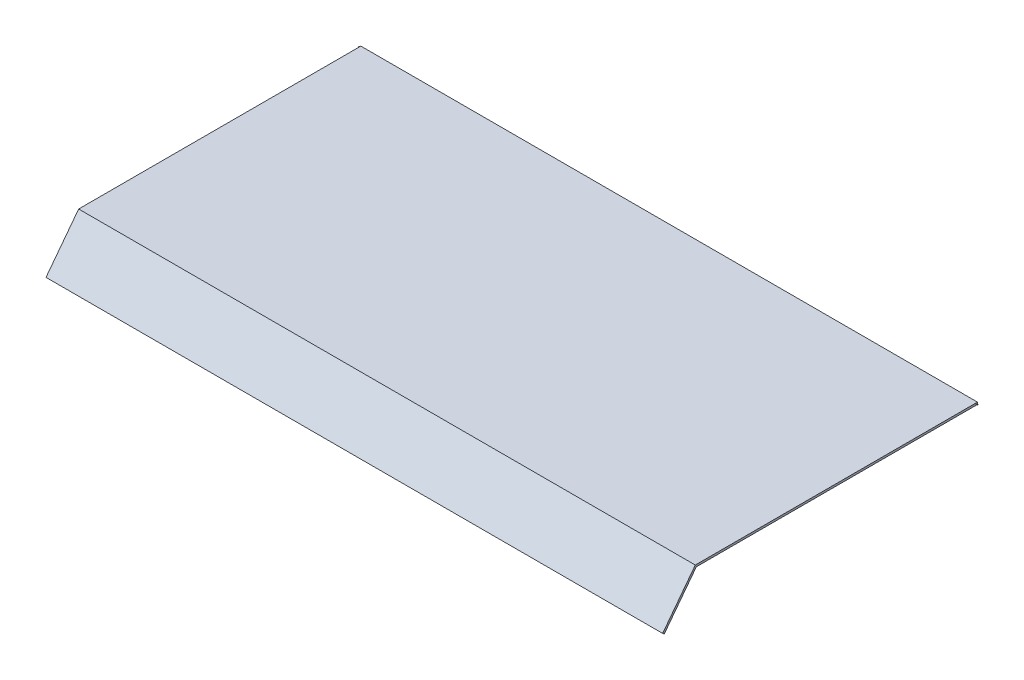
ISO-10303-21;
HEADER;
FILE_DESCRIPTION(('STEP AP214'),'2;1');
FILE_NAME('part.step','',(''),(''),'','','');
FILE_SCHEMA(('AUTOMOTIVE_DESIGN { 1 0 10303 214 1 1 1 1 }'));
ENDSEC;
DATA;
#1=APPLICATION_CONTEXT('core data for automotive mechanical design processes');
#2=APPLICATION_PROTOCOL_DEFINITION('international standard','automotive_design',2000,#1);
#3=PRODUCT_CONTEXT('',#1,'mechanical');
#4=PRODUCT('Part','Part','',(#3));
#5=PRODUCT_RELATED_PRODUCT_CATEGORY('part','',(#4));
#6=PRODUCT_DEFINITION_FORMATION('','',#4);
#7=PRODUCT_DEFINITION_CONTEXT('part definition',#1,'design');
#8=PRODUCT_DEFINITION('design','',#6,#7);
#9=PRODUCT_DEFINITION_SHAPE('','',#8);
#10=(LENGTH_UNIT() NAMED_UNIT(*) SI_UNIT(.MILLI.,.METRE.));
#11=(NAMED_UNIT(*) PLANE_ANGLE_UNIT() SI_UNIT($,.RADIAN.));
#12=(NAMED_UNIT(*) SI_UNIT($,.STERADIAN.) SOLID_ANGLE_UNIT());
#13=UNCERTAINTY_MEASURE_WITH_UNIT(LENGTH_MEASURE(1.E-05),#10,'distance_accuracy_value','');
#14=(GEOMETRIC_REPRESENTATION_CONTEXT(3) GLOBAL_UNCERTAINTY_ASSIGNED_CONTEXT((#13)) GLOBAL_UNIT_ASSIGNED_CONTEXT((#10,
#11,#12)) REPRESENTATION_CONTEXT('',''));
#15=CARTESIAN_POINT('',(0.,0.,0.));
#16=DIRECTION('',(0.,0.,1.));
#17=DIRECTION('',(1.,0.,0.));
#18=AXIS2_PLACEMENT_3D('',#15,#16,#17);
#19=CARTESIAN_POINT('',(147.5,0.,0.));
#20=DIRECTION('',(0.,0.605571808276571,0.795790666583018));
#21=DIRECTION('',(0.,-0.795790666583018,0.605571808276571));
#22=AXIS2_PLACEMENT_3D('',#19,#20,#21);
#23=PLANE('',#22);
#24=DIRECTION('',(-1.,0.,0.));
#25=VECTOR('',#24,1.);
#26=CARTESIAN_POINT('',(147.5,-20.1335038645504,15.3209667493973));
#27=LINE('',#26,#25);
#28=CARTESIAN_POINT('',(147.5,-20.1335038645504,15.3209667493973));
#29=VERTEX_POINT('',#28);
#30=CARTESIAN_POINT('',(-147.5,-20.1335038645504,15.3209667493973));
#31=VERTEX_POINT('',#30);
#32=EDGE_CURVE('E103',#29,#31,#27,.T.);
#33=ORIENTED_EDGE('',*,*,#32,.T.);
#34=DIRECTION('',(0.,0.795790666583018,-0.605571808276571));
#35=VECTOR('',#34,1.);
#36=CARTESIAN_POINT('',(-147.5,0.,0.));
#37=LINE('',#36,#35);
#38=CARTESIAN_POINT('',(-147.5,0.,0.));
#39=VERTEX_POINT('',#38);
#40=EDGE_CURVE('E98',#31,#39,#37,.T.);
#41=ORIENTED_EDGE('',*,*,#40,.T.);
#42=DIRECTION('',(-1.,0.,0.));
#43=VECTOR('',#42,1.);
#44=CARTESIAN_POINT('',(147.5,0.,0.));
#45=LINE('',#44,#43);
#46=CARTESIAN_POINT('',(147.5,0.,0.));
#47=VERTEX_POINT('',#46);
#48=EDGE_CURVE('E39',#47,#39,#45,.T.);
#49=ORIENTED_EDGE('',*,*,#48,.F.);
#50=DIRECTION('',(0.,0.795790666583018,-0.605571808276571));
#51=VECTOR('',#50,1.);
#52=CARTESIAN_POINT('',(147.5,0.,0.));
#53=LINE('',#52,#51);
#54=EDGE_CURVE('E125',#29,#47,#53,.T.);
#55=ORIENTED_EDGE('',*,*,#54,.F.);
#56=EDGE_LOOP('',(#33,#41,#49,#55));
#57=FACE_BOUND('',#56,.T.);
#58=ADVANCED_FACE('F32',(#57),#23,.F.);
#59=CARTESIAN_POINT('',(147.5,0.,0.));
#60=DIRECTION('',(0.,1.,0.));
#61=DIRECTION('',(0.,0.,1.));
#62=AXIS2_PLACEMENT_3D('',#59,#60,#61);
#63=PLANE('',#62);
#64=ORIENTED_EDGE('',*,*,#48,.T.);
#65=DIRECTION('',(0.,0.,-1.));
#66=VECTOR('',#65,1.);
#67=CARTESIAN_POINT('',(-147.5,0.,0.));
#68=LINE('',#67,#66);
#69=CARTESIAN_POINT('',(-147.5,0.,-134.5));
#70=VERTEX_POINT('',#69);
#71=EDGE_CURVE('E87',#39,#70,#68,.T.);
#72=ORIENTED_EDGE('',*,*,#71,.T.);
#73=DIRECTION('',(-1.,0.,0.));
#74=VECTOR('',#73,1.);
#75=CARTESIAN_POINT('',(147.5,0.,-134.5));
#76=LINE('',#75,#74);
#77=CARTESIAN_POINT('',(147.5,0.,-134.5));
#78=VERTEX_POINT('',#77);
#79=EDGE_CURVE('E92',#78,#70,#76,.T.);
#80=ORIENTED_EDGE('',*,*,#79,.F.);
#81=DIRECTION('',(0.,0.,-1.));
#82=VECTOR('',#81,1.);
#83=CARTESIAN_POINT('',(147.5,0.,0.));
#84=LINE('',#83,#82);
#85=EDGE_CURVE('E88',#47,#78,#84,.T.);
#86=ORIENTED_EDGE('',*,*,#85,.F.);
#87=EDGE_LOOP('',(#64,#72,#80,#86));
#88=FACE_BOUND('',#87,.T.);
#89=ADVANCED_FACE('F85',(#88),#63,.F.);
#90=CARTESIAN_POINT('',(147.5,1.,-134.5));
#91=DIRECTION('',(0.,0.,1.));
#92=DIRECTION('',(1.,0.,0.));
#93=AXIS2_PLACEMENT_3D('',#90,#91,#92);
#94=PLANE('',#93);
#95=ORIENTED_EDGE('',*,*,#79,.T.);
#96=DIRECTION('',(0.,1.,0.));
#97=VECTOR('',#96,1.);
#98=CARTESIAN_POINT('',(-147.5,1.,-134.5));
#99=LINE('',#98,#97);
#100=CARTESIAN_POINT('',(-147.5,1.,-134.5));
#101=VERTEX_POINT('',#100);
#102=EDGE_CURVE('E101',#70,#101,#99,.T.);
#103=ORIENTED_EDGE('',*,*,#102,.T.);
#104=DIRECTION('',(-1.,0.,0.));
#105=VECTOR('',#104,1.);
#106=CARTESIAN_POINT('',(147.5,1.,-134.5));
#107=LINE('',#106,#105);
#108=CARTESIAN_POINT('',(147.5,1.,-134.5));
#109=VERTEX_POINT('',#108);
#110=EDGE_CURVE('E139',#109,#101,#107,.T.);
#111=ORIENTED_EDGE('',*,*,#110,.F.);
#112=DIRECTION('',(0.,1.,0.));
#113=VECTOR('',#112,1.);
#114=CARTESIAN_POINT('',(147.5,1.,-134.5));
#115=LINE('',#114,#113);
#116=EDGE_CURVE('E128',#78,#109,#115,.T.);
#117=ORIENTED_EDGE('',*,*,#116,.F.);
#118=EDGE_LOOP('',(#95,#103,#111,#117));
#119=FACE_BOUND('',#118,.T.);
#120=ADVANCED_FACE('F143',(#119),#94,.F.);
#121=CARTESIAN_POINT('',(147.5,1.,0.4956431487404));
#122=DIRECTION('',(0.,-1.,0.));
#123=DIRECTION('',(0.,0.,-1.));
#124=AXIS2_PLACEMENT_3D('',#121,#122,#123);
#125=PLANE('',#124);
#126=ORIENTED_EDGE('',*,*,#110,.T.);
#127=DIRECTION('',(0.,0.,1.));
#128=VECTOR('',#127,1.);
#129=CARTESIAN_POINT('',(-147.5,1.,0.4956431487404));
#130=LINE('',#129,#128);
#131=CARTESIAN_POINT('',(-147.5,1.,0.4956431487404));
#132=VERTEX_POINT('',#131);
#133=EDGE_CURVE('E111',#101,#132,#130,.T.);
#134=ORIENTED_EDGE('',*,*,#133,.T.);
#135=DIRECTION('',(-1.,0.,0.));
#136=VECTOR('',#135,1.);
#137=CARTESIAN_POINT('',(147.5,1.,0.4956431487404));
#138=LINE('',#137,#136);
#139=CARTESIAN_POINT('',(147.5,1.,0.4956431487404));
#140=VERTEX_POINT('',#139);
#141=EDGE_CURVE('E137',#140,#132,#138,.T.);
#142=ORIENTED_EDGE('',*,*,#141,.F.);
#143=DIRECTION('',(0.,0.,1.));
#144=VECTOR('',#143,1.);
#145=CARTESIAN_POINT('',(147.5,1.,0.4956431487404));
#146=LINE('',#145,#144);
#147=EDGE_CURVE('E130',#109,#140,#146,.T.);
#148=ORIENTED_EDGE('',*,*,#147,.F.);
#149=EDGE_LOOP('',(#126,#134,#142,#148));
#150=FACE_BOUND('',#149,.T.);
#151=ADVANCED_FACE('F149',(#150),#125,.F.);
#152=CARTESIAN_POINT('',(147.5,1.,0.4956431487404));
#153=DIRECTION('',(0.,-0.605571808276571,-0.795790666583018));
#154=DIRECTION('',(0.,0.795790666583018,-0.605571808276571));
#155=AXIS2_PLACEMENT_3D('',#152,#153,#154);
#156=PLANE('',#155);
#157=ORIENTED_EDGE('',*,*,#141,.T.);
#158=DIRECTION('',(0.,-0.795790666583018,0.605571808276571));
#159=VECTOR('',#158,1.);
#160=CARTESIAN_POINT('',(-147.5,1.,0.4956431487404));
#161=LINE('',#160,#159);
#162=CARTESIAN_POINT('',(-147.5,-19.5279320562738,16.1167574159803));
#163=VERTEX_POINT('',#162);
#164=EDGE_CURVE('E114',#132,#163,#161,.T.);
#165=ORIENTED_EDGE('',*,*,#164,.T.);
#166=DIRECTION('',(-1.,0.,0.));
#167=VECTOR('',#166,1.);
#168=CARTESIAN_POINT('',(147.5,-19.5279320562738,16.1167574159803));
#169=LINE('',#168,#167);
#170=CARTESIAN_POINT('',(147.5,-19.5279320562738,16.1167574159803));
#171=VERTEX_POINT('',#170);
#172=EDGE_CURVE('E135',#171,#163,#169,.T.);
#173=ORIENTED_EDGE('',*,*,#172,.F.);
#174=DIRECTION('',(0.,-0.795790666583018,0.605571808276571));
#175=VECTOR('',#174,1.);
#176=CARTESIAN_POINT('',(147.5,1.,0.4956431487404));
#177=LINE('',#176,#175);
#178=EDGE_CURVE('E51',#140,#171,#177,.T.);
#179=ORIENTED_EDGE('',*,*,#178,.F.);
#180=EDGE_LOOP('',(#157,#165,#173,#179));
#181=FACE_BOUND('',#180,.T.);
#182=ADVANCED_FACE('F152',(#181),#156,.F.);
#183=CARTESIAN_POINT('',(147.5,-20.1335038645504,15.3209667493973));
#184=DIRECTION('',(0.,0.795790666583016,-0.605571808276574));
#185=DIRECTION('',(0.,0.605571808276574,0.795790666583016));
#186=AXIS2_PLACEMENT_3D('',#183,#184,#185);
#187=PLANE('',#186);
#188=ORIENTED_EDGE('',*,*,#172,.T.);
#189=DIRECTION('',(0.,-0.605571808276574,-0.795790666583016));
#190=VECTOR('',#189,1.);
#191=CARTESIAN_POINT('',(-147.5,-20.1335038645504,15.3209667493973));
#192=LINE('',#191,#190);
#193=EDGE_CURVE('E117',#163,#31,#192,.T.);
#194=ORIENTED_EDGE('',*,*,#193,.T.);
#195=ORIENTED_EDGE('',*,*,#32,.F.);
#196=DIRECTION('',(0.,-0.605571808276574,-0.795790666583016));
#197=VECTOR('',#196,1.);
#198=CARTESIAN_POINT('',(147.5,-20.1335038645504,15.3209667493973));
#199=LINE('',#198,#197);
#200=EDGE_CURVE('E46',#171,#29,#199,.T.);
#201=ORIENTED_EDGE('',*,*,#200,.F.);
#202=EDGE_LOOP('',(#188,#194,#195,#201));
#203=FACE_BOUND('',#202,.T.);
#204=ADVANCED_FACE('F154',(#203),#187,.F.);
#205=CARTESIAN_POINT('',(147.5,0.,0.));
#206=DIRECTION('',(-1.,0.,0.));
#207=DIRECTION('',(0.,0.,1.));
#208=AXIS2_PLACEMENT_3D('',#205,#206,#207);
#209=PLANE('',#208);
#210=CARTESIAN_POINT('',(147.5,0.5,-134.));
#211=DIRECTION('',(-1.,0.,0.));
#212=DIRECTION('',(0.,0.,1.));
#213=AXIS2_PLACEMENT_3D('',#210,#211,#212);
#214=CIRCLE('',#213,0.250000000000013);
#215=CARTESIAN_POINT('',(147.5,0.5,-133.75));
#216=VERTEX_POINT('',#215);
#217=EDGE_CURVE('E11',#216,#216,#214,.F.);
#218=ORIENTED_EDGE('',*,*,#217,.F.);
#219=EDGE_LOOP('',(#218));
#220=FACE_BOUND('',#219,.T.);
#221=ORIENTED_EDGE('',*,*,#54,.T.);
#222=ORIENTED_EDGE('',*,*,#85,.T.);
#223=ORIENTED_EDGE('',*,*,#116,.T.);
#224=ORIENTED_EDGE('',*,*,#147,.T.);
#225=ORIENTED_EDGE('',*,*,#178,.T.);
#226=ORIENTED_EDGE('',*,*,#200,.T.);
#227=EDGE_LOOP('',(#221,#222,#223,#224,#225,#226));
#228=FACE_BOUND('',#227,.T.);
#229=ADVANCED_FACE('F146',(#220,#228),#209,.F.);
#230=CARTESIAN_POINT('',(148.,0.5,-134.));
#231=DIRECTION('',(-1.,0.,0.));
#232=DIRECTION('',(0.,0.,1.));
#233=AXIS2_PLACEMENT_3D('',#230,#231,#232);
#234=CYLINDRICAL_SURFACE('',#233,0.250000000000013);
#235=CARTESIAN_POINT('',(148.,0.5,-134.));
#236=DIRECTION('',(1.,0.,0.));
#237=DIRECTION('',(0.,0.,-1.));
#238=AXIS2_PLACEMENT_3D('',#235,#236,#237);
#239=CIRCLE('',#238,0.250000000000013);
#240=CARTESIAN_POINT('',(148.,0.5,-134.25));
#241=VERTEX_POINT('',#240);
#242=EDGE_CURVE('E122',#241,#241,#239,.T.);
#243=ORIENTED_EDGE('',*,*,#242,.F.);
#244=EDGE_LOOP('',(#243));
#245=FACE_BOUND('',#244,.T.);
#246=ORIENTED_EDGE('',*,*,#217,.T.);
#247=EDGE_LOOP('',(#246));
#248=FACE_BOUND('',#247,.T.);
#249=ADVANCED_FACE('F161',(#245,#248),#234,.T.);
#250=CARTESIAN_POINT('',(148.,0.5,-134.));
#251=DIRECTION('',(1.,0.,0.));
#252=DIRECTION('',(0.,0.,-1.));
#253=AXIS2_PLACEMENT_3D('',#250,#251,#252);
#254=PLANE('',#253);
#255=ORIENTED_EDGE('',*,*,#242,.T.);
#256=EDGE_LOOP('',(#255));
#257=FACE_BOUND('',#256,.T.);
#258=ADVANCED_FACE('F199',(#257),#254,.T.);
#259=CARTESIAN_POINT('',(-147.5,0.,0.));
#260=DIRECTION('',(1.,0.,0.));
#261=DIRECTION('',(0.,0.,1.));
#262=AXIS2_PLACEMENT_3D('',#259,#260,#261);
#263=PLANE('',#262);
#264=CARTESIAN_POINT('',(-147.5,0.5,-134.));
#265=DIRECTION('',(-1.,0.,0.));
#266=DIRECTION('',(0.,0.,1.));
#267=AXIS2_PLACEMENT_3D('',#264,#265,#266);
#268=CIRCLE('',#267,0.250000000000013);
#269=CARTESIAN_POINT('',(-147.5,0.5,-133.75));
#270=VERTEX_POINT('',#269);
#271=EDGE_CURVE('E119',#270,#270,#268,.F.);
#272=ORIENTED_EDGE('',*,*,#271,.T.);
#273=EDGE_LOOP('',(#272));
#274=FACE_BOUND('',#273,.T.);
#275=ORIENTED_EDGE('',*,*,#40,.F.);
#276=ORIENTED_EDGE('',*,*,#193,.F.);
#277=ORIENTED_EDGE('',*,*,#164,.F.);
#278=ORIENTED_EDGE('',*,*,#133,.F.);
#279=ORIENTED_EDGE('',*,*,#102,.F.);
#280=ORIENTED_EDGE('',*,*,#71,.F.);
#281=EDGE_LOOP('',(#275,#276,#277,#278,#279,#280));
#282=FACE_BOUND('',#281,.T.);
#283=ADVANCED_FACE('F96',(#274,#282),#263,.F.);
#284=CARTESIAN_POINT('',(-148.,0.5,-134.));
#285=DIRECTION('',(1.,0.,0.));
#286=DIRECTION('',(0.,0.,1.));
#287=AXIS2_PLACEMENT_3D('',#284,#285,#286);
#288=CYLINDRICAL_SURFACE('',#287,0.250000000000013);
#289=CARTESIAN_POINT('',(-148.,0.5,-134.));
#290=DIRECTION('',(1.,0.,0.));
#291=DIRECTION('',(0.,0.,-1.));
#292=AXIS2_PLACEMENT_3D('',#289,#290,#291);
#293=CIRCLE('',#292,0.250000000000013);
#294=CARTESIAN_POINT('',(-148.,0.5,-134.25));
#295=VERTEX_POINT('',#294);
#296=EDGE_CURVE('E105',#295,#295,#293,.T.);
#297=ORIENTED_EDGE('',*,*,#296,.T.);
#298=EDGE_LOOP('',(#297));
#299=FACE_BOUND('',#298,.T.);
#300=ORIENTED_EDGE('',*,*,#271,.F.);
#301=EDGE_LOOP('',(#300));
#302=FACE_BOUND('',#301,.T.);
#303=ADVANCED_FACE('F198',(#299,#302),#288,.T.);
#304=CARTESIAN_POINT('',(-148.,0.5,-134.));
#305=DIRECTION('',(-1.,0.,0.));
#306=DIRECTION('',(0.,0.,-1.));
#307=AXIS2_PLACEMENT_3D('',#304,#305,#306);
#308=PLANE('',#307);
#309=ORIENTED_EDGE('',*,*,#296,.F.);
#310=EDGE_LOOP('',(#309));
#311=FACE_BOUND('',#310,.T.);
#312=ADVANCED_FACE('F210',(#311),#308,.T.);
#313=CLOSED_SHELL('',(#58,#89,#120,#151,#182,#204,#229,#249,#258,#283,#303,#312));
#314=MANIFOLD_SOLID_BREP('B2',#313);
#315=ADVANCED_BREP_SHAPE_REPRESENTATION('',(#18,#314),#14);
#316=SHAPE_DEFINITION_REPRESENTATION(#9,#315);
ENDSEC;
END-ISO-10303-21;
